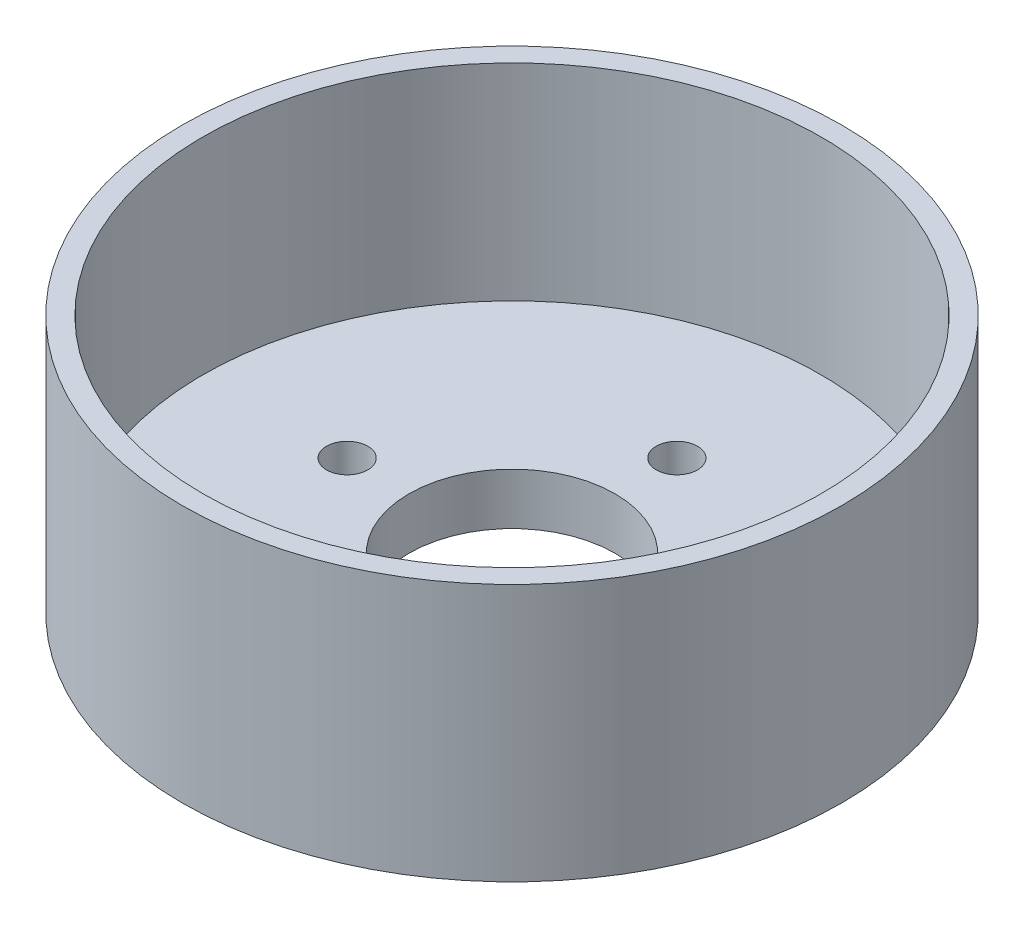
ISO-10303-21;
HEADER;
FILE_DESCRIPTION(('STEP AP214'),'2;1');
FILE_NAME('part.step','',(''),(''),'','','');
FILE_SCHEMA(('AUTOMOTIVE_DESIGN { 1 0 10303 214 1 1 1 1 }'));
ENDSEC;
DATA;
#1=APPLICATION_CONTEXT('core data for automotive mechanical design processes');
#2=APPLICATION_PROTOCOL_DEFINITION('international standard','automotive_design',2000,#1);
#3=PRODUCT_CONTEXT('',#1,'mechanical');
#4=PRODUCT('Part','Part','',(#3));
#5=PRODUCT_RELATED_PRODUCT_CATEGORY('part','',(#4));
#6=PRODUCT_DEFINITION_FORMATION('','',#4);
#7=PRODUCT_DEFINITION_CONTEXT('part definition',#1,'design');
#8=PRODUCT_DEFINITION('design','',#6,#7);
#9=PRODUCT_DEFINITION_SHAPE('','',#8);
#10=(LENGTH_UNIT() NAMED_UNIT(*) SI_UNIT(.MILLI.,.METRE.));
#11=(NAMED_UNIT(*) PLANE_ANGLE_UNIT() SI_UNIT($,.RADIAN.));
#12=(NAMED_UNIT(*) SI_UNIT($,.STERADIAN.) SOLID_ANGLE_UNIT());
#13=UNCERTAINTY_MEASURE_WITH_UNIT(LENGTH_MEASURE(1.E-05),#10,'distance_accuracy_value','');
#14=(GEOMETRIC_REPRESENTATION_CONTEXT(3) GLOBAL_UNCERTAINTY_ASSIGNED_CONTEXT((#13)) GLOBAL_UNIT_ASSIGNED_CONTEXT((#10,
#11,#12)) REPRESENTATION_CONTEXT('',''));
#15=CARTESIAN_POINT('',(0.,0.,0.));
#16=DIRECTION('',(0.,0.,1.));
#17=DIRECTION('',(1.,0.,0.));
#18=AXIS2_PLACEMENT_3D('',#15,#16,#17);
#19=CARTESIAN_POINT('',(0.,12.5,0.));
#20=DIRECTION('',(0.,-1.,0.));
#21=DIRECTION('',(0.,0.,-1.));
#22=AXIS2_PLACEMENT_3D('',#19,#20,#21);
#23=CYLINDRICAL_SURFACE('',#22,16.);
#24=CARTESIAN_POINT('',(0.,12.5,0.));
#25=DIRECTION('',(0.,1.,0.));
#26=DIRECTION('',(0.,0.,1.));
#27=AXIS2_PLACEMENT_3D('',#24,#25,#26);
#28=CIRCLE('',#27,16.);
#29=CARTESIAN_POINT('',(0.,12.5,16.));
#30=VERTEX_POINT('',#29);
#31=EDGE_CURVE('E10',#30,#30,#28,.T.);
#32=ORIENTED_EDGE('',*,*,#31,.F.);
#33=EDGE_LOOP('',(#32));
#34=FACE_BOUND('',#33,.T.);
#35=CARTESIAN_POINT('',(0.,0.,0.));
#36=DIRECTION('',(0.,1.,0.));
#37=DIRECTION('',(0.,0.,1.));
#38=AXIS2_PLACEMENT_3D('',#35,#36,#37);
#39=CIRCLE('',#38,16.);
#40=CARTESIAN_POINT('',(0.,0.,16.));
#41=VERTEX_POINT('',#40);
#42=EDGE_CURVE('E38',#41,#41,#39,.T.);
#43=ORIENTED_EDGE('',*,*,#42,.T.);
#44=EDGE_LOOP('',(#43));
#45=FACE_BOUND('',#44,.T.);
#46=ADVANCED_FACE('F31',(#34,#45),#23,.T.);
#47=CARTESIAN_POINT('',(0.,12.5,0.));
#48=DIRECTION('',(0.,1.,0.));
#49=DIRECTION('',(0.,0.,1.));
#50=AXIS2_PLACEMENT_3D('',#47,#48,#49);
#51=PLANE('',#50);
#52=CARTESIAN_POINT('',(0.,12.5,0.));
#53=DIRECTION('',(0.,1.,0.));
#54=DIRECTION('',(0.,0.,1.));
#55=AXIS2_PLACEMENT_3D('',#52,#53,#54);
#56=CIRCLE('',#55,15.);
#57=CARTESIAN_POINT('',(0.,12.5,15.));
#58=VERTEX_POINT('',#57);
#59=EDGE_CURVE('E46',#58,#58,#56,.T.);
#60=ORIENTED_EDGE('',*,*,#59,.F.);
#61=EDGE_LOOP('',(#60));
#62=FACE_BOUND('',#61,.T.);
#63=ORIENTED_EDGE('',*,*,#31,.T.);
#64=EDGE_LOOP('',(#63));
#65=FACE_BOUND('',#64,.T.);
#66=ADVANCED_FACE('F81',(#62,#65),#51,.T.);
#67=CARTESIAN_POINT('',(0.,0.,0.));
#68=DIRECTION('',(0.,1.,0.));
#69=DIRECTION('',(0.,0.,1.));
#70=AXIS2_PLACEMENT_3D('',#67,#68,#69);
#71=PLANE('',#70);
#72=CARTESIAN_POINT('',(0.,0.,-8.));
#73=DIRECTION('',(0.,-1.,0.));
#74=DIRECTION('',(0.,0.,-1.));
#75=AXIS2_PLACEMENT_3D('',#72,#73,#74);
#76=CIRCLE('',#75,1.);
#77=CARTESIAN_POINT('',(0.,0.,-9.));
#78=VERTEX_POINT('',#77);
#79=EDGE_CURVE('E57',#78,#78,#76,.T.);
#80=ORIENTED_EDGE('',*,*,#79,.F.);
#81=EDGE_LOOP('',(#80));
#82=FACE_BOUND('',#81,.T.);
#83=CARTESIAN_POINT('',(-8.,0.,0.));
#84=DIRECTION('',(0.,-1.,0.));
#85=DIRECTION('',(0.,0.,-1.));
#86=AXIS2_PLACEMENT_3D('',#83,#84,#85);
#87=CIRCLE('',#86,1.);
#88=CARTESIAN_POINT('',(-8.,0.,-1.));
#89=VERTEX_POINT('',#88);
#90=EDGE_CURVE('E121',#89,#89,#87,.T.);
#91=ORIENTED_EDGE('',*,*,#90,.F.);
#92=EDGE_LOOP('',(#91));
#93=FACE_BOUND('',#92,.T.);
#94=CARTESIAN_POINT('',(0.,0.,8.));
#95=DIRECTION('',(0.,-1.,0.));
#96=DIRECTION('',(0.,0.,-1.));
#97=AXIS2_PLACEMENT_3D('',#94,#95,#96);
#98=CIRCLE('',#97,1.);
#99=CARTESIAN_POINT('',(0.,0.,7.));
#100=VERTEX_POINT('',#99);
#101=EDGE_CURVE('E124',#100,#100,#98,.T.);
#102=ORIENTED_EDGE('',*,*,#101,.F.);
#103=EDGE_LOOP('',(#102));
#104=FACE_BOUND('',#103,.T.);
#105=CARTESIAN_POINT('',(8.,0.,0.));
#106=DIRECTION('',(0.,-1.,0.));
#107=DIRECTION('',(0.,0.,-1.));
#108=AXIS2_PLACEMENT_3D('',#105,#106,#107);
#109=CIRCLE('',#108,1.);
#110=CARTESIAN_POINT('',(8.,0.,-1.));
#111=VERTEX_POINT('',#110);
#112=EDGE_CURVE('E71',#111,#111,#109,.T.);
#113=ORIENTED_EDGE('',*,*,#112,.F.);
#114=EDGE_LOOP('',(#113));
#115=FACE_BOUND('',#114,.T.);
#116=CARTESIAN_POINT('',(0.,0.,0.));
#117=DIRECTION('',(0.,-1.,0.));
#118=DIRECTION('',(0.,0.,-1.));
#119=AXIS2_PLACEMENT_3D('',#116,#117,#118);
#120=CIRCLE('',#119,5.);
#121=CARTESIAN_POINT('',(0.,0.,-5.));
#122=VERTEX_POINT('',#121);
#123=EDGE_CURVE('E52',#122,#122,#120,.T.);
#124=ORIENTED_EDGE('',*,*,#123,.F.);
#125=EDGE_LOOP('',(#124));
#126=FACE_BOUND('',#125,.T.);
#127=ORIENTED_EDGE('',*,*,#42,.F.);
#128=EDGE_LOOP('',(#127));
#129=FACE_BOUND('',#128,.T.);
#130=ADVANCED_FACE('F83',(#82,#93,#104,#115,#126,#129),#71,.F.);
#131=CARTESIAN_POINT('',(0.,2.5,0.));
#132=DIRECTION('',(0.,1.,0.));
#133=DIRECTION('',(0.,0.,1.));
#134=AXIS2_PLACEMENT_3D('',#131,#132,#133);
#135=CYLINDRICAL_SURFACE('',#134,15.);
#136=CARTESIAN_POINT('',(0.,2.5,0.));
#137=DIRECTION('',(0.,1.,0.));
#138=DIRECTION('',(0.,0.,1.));
#139=AXIS2_PLACEMENT_3D('',#136,#137,#138);
#140=CIRCLE('',#139,15.);
#141=CARTESIAN_POINT('',(0.,2.5,15.));
#142=VERTEX_POINT('',#141);
#143=EDGE_CURVE('E43',#142,#142,#140,.T.);
#144=ORIENTED_EDGE('',*,*,#143,.F.);
#145=EDGE_LOOP('',(#144));
#146=FACE_BOUND('',#145,.T.);
#147=ORIENTED_EDGE('',*,*,#59,.T.);
#148=EDGE_LOOP('',(#147));
#149=FACE_BOUND('',#148,.T.);
#150=ADVANCED_FACE('F79',(#146,#149),#135,.F.);
#151=CARTESIAN_POINT('',(0.,2.5,0.));
#152=DIRECTION('',(0.,1.,0.));
#153=DIRECTION('',(0.,0.,1.));
#154=AXIS2_PLACEMENT_3D('',#151,#152,#153);
#155=PLANE('',#154);
#156=CARTESIAN_POINT('',(0.,2.5,-8.));
#157=DIRECTION('',(0.,1.,0.));
#158=DIRECTION('',(0.,0.,1.));
#159=AXIS2_PLACEMENT_3D('',#156,#157,#158);
#160=CIRCLE('',#159,1.);
#161=CARTESIAN_POINT('',(0.,2.5,-7.));
#162=VERTEX_POINT('',#161);
#163=EDGE_CURVE('E34',#162,#162,#160,.T.);
#164=ORIENTED_EDGE('',*,*,#163,.F.);
#165=EDGE_LOOP('',(#164));
#166=FACE_BOUND('',#165,.T.);
#167=CARTESIAN_POINT('',(-8.,2.5,0.));
#168=DIRECTION('',(0.,1.,0.));
#169=DIRECTION('',(0.,0.,1.));
#170=AXIS2_PLACEMENT_3D('',#167,#168,#169);
#171=CIRCLE('',#170,1.);
#172=CARTESIAN_POINT('',(-8.,2.5,1.));
#173=VERTEX_POINT('',#172);
#174=EDGE_CURVE('E59',#173,#173,#171,.T.);
#175=ORIENTED_EDGE('',*,*,#174,.F.);
#176=EDGE_LOOP('',(#175));
#177=FACE_BOUND('',#176,.T.);
#178=CARTESIAN_POINT('',(0.,2.5,8.));
#179=DIRECTION('',(0.,1.,0.));
#180=DIRECTION('',(0.,0.,1.));
#181=AXIS2_PLACEMENT_3D('',#178,#179,#180);
#182=CIRCLE('',#181,1.);
#183=CARTESIAN_POINT('',(0.,2.5,9.));
#184=VERTEX_POINT('',#183);
#185=EDGE_CURVE('E56',#184,#184,#182,.T.);
#186=ORIENTED_EDGE('',*,*,#185,.F.);
#187=EDGE_LOOP('',(#186));
#188=FACE_BOUND('',#187,.T.);
#189=CARTESIAN_POINT('',(8.,2.5,0.));
#190=DIRECTION('',(0.,1.,0.));
#191=DIRECTION('',(0.,0.,1.));
#192=AXIS2_PLACEMENT_3D('',#189,#190,#191);
#193=CIRCLE('',#192,1.);
#194=CARTESIAN_POINT('',(8.,2.5,1.));
#195=VERTEX_POINT('',#194);
#196=EDGE_CURVE('E53',#195,#195,#193,.T.);
#197=ORIENTED_EDGE('',*,*,#196,.F.);
#198=EDGE_LOOP('',(#197));
#199=FACE_BOUND('',#198,.T.);
#200=CARTESIAN_POINT('',(0.,2.5,0.));
#201=DIRECTION('',(0.,1.,0.));
#202=DIRECTION('',(0.,0.,1.));
#203=AXIS2_PLACEMENT_3D('',#200,#201,#202);
#204=CIRCLE('',#203,5.);
#205=CARTESIAN_POINT('',(0.,2.5,5.));
#206=VERTEX_POINT('',#205);
#207=EDGE_CURVE('E49',#206,#206,#204,.T.);
#208=ORIENTED_EDGE('',*,*,#207,.F.);
#209=EDGE_LOOP('',(#208));
#210=FACE_BOUND('',#209,.T.);
#211=ORIENTED_EDGE('',*,*,#143,.T.);
#212=EDGE_LOOP('',(#211));
#213=FACE_BOUND('',#212,.T.);
#214=ADVANCED_FACE('F94',(#166,#177,#188,#199,#210,#213),#155,.T.);
#215=CARTESIAN_POINT('',(0.,10.,0.));
#216=DIRECTION('',(0.,-1.,0.));
#217=DIRECTION('',(0.,0.,-1.));
#218=AXIS2_PLACEMENT_3D('',#215,#216,#217);
#219=CYLINDRICAL_SURFACE('',#218,5.);
#220=ORIENTED_EDGE('',*,*,#207,.T.);
#221=EDGE_LOOP('',(#220));
#222=FACE_BOUND('',#221,.T.);
#223=ORIENTED_EDGE('',*,*,#123,.T.);
#224=EDGE_LOOP('',(#223));
#225=FACE_BOUND('',#224,.T.);
#226=ADVANCED_FACE('F98',(#222,#225),#219,.F.);
#227=CARTESIAN_POINT('',(8.,10.,0.));
#228=DIRECTION('',(0.,-1.,0.));
#229=DIRECTION('',(0.,0.,-1.));
#230=AXIS2_PLACEMENT_3D('',#227,#228,#229);
#231=CYLINDRICAL_SURFACE('',#230,1.);
#232=ORIENTED_EDGE('',*,*,#196,.T.);
#233=EDGE_LOOP('',(#232));
#234=FACE_BOUND('',#233,.T.);
#235=ORIENTED_EDGE('',*,*,#112,.T.);
#236=EDGE_LOOP('',(#235));
#237=FACE_BOUND('',#236,.T.);
#238=ADVANCED_FACE('F102',(#234,#237),#231,.F.);
#239=CARTESIAN_POINT('',(0.,10.,8.));
#240=DIRECTION('',(0.,-1.,0.));
#241=DIRECTION('',(0.,0.,-1.));
#242=AXIS2_PLACEMENT_3D('',#239,#240,#241);
#243=CYLINDRICAL_SURFACE('',#242,1.);
#244=ORIENTED_EDGE('',*,*,#185,.T.);
#245=EDGE_LOOP('',(#244));
#246=FACE_BOUND('',#245,.T.);
#247=ORIENTED_EDGE('',*,*,#101,.T.);
#248=EDGE_LOOP('',(#247));
#249=FACE_BOUND('',#248,.T.);
#250=ADVANCED_FACE('F106',(#246,#249),#243,.F.);
#251=CARTESIAN_POINT('',(-8.,10.,0.));
#252=DIRECTION('',(0.,-1.,0.));
#253=DIRECTION('',(0.,0.,-1.));
#254=AXIS2_PLACEMENT_3D('',#251,#252,#253);
#255=CYLINDRICAL_SURFACE('',#254,1.);
#256=ORIENTED_EDGE('',*,*,#174,.T.);
#257=EDGE_LOOP('',(#256));
#258=FACE_BOUND('',#257,.T.);
#259=ORIENTED_EDGE('',*,*,#90,.T.);
#260=EDGE_LOOP('',(#259));
#261=FACE_BOUND('',#260,.T.);
#262=ADVANCED_FACE('F110',(#258,#261),#255,.F.);
#263=CARTESIAN_POINT('',(0.,10.,-8.));
#264=DIRECTION('',(0.,-1.,0.));
#265=DIRECTION('',(0.,0.,-1.));
#266=AXIS2_PLACEMENT_3D('',#263,#264,#265);
#267=CYLINDRICAL_SURFACE('',#266,1.);
#268=ORIENTED_EDGE('',*,*,#163,.T.);
#269=EDGE_LOOP('',(#268));
#270=FACE_BOUND('',#269,.T.);
#271=ORIENTED_EDGE('',*,*,#79,.T.);
#272=EDGE_LOOP('',(#271));
#273=FACE_BOUND('',#272,.T.);
#274=ADVANCED_FACE('F114',(#270,#273),#267,.F.);
#275=CLOSED_SHELL('',(#46,#66,#130,#150,#214,#226,#238,#250,#262,#274));
#276=MANIFOLD_SOLID_BREP('B2',#275);
#277=ADVANCED_BREP_SHAPE_REPRESENTATION('',(#18,#276),#14);
#278=SHAPE_DEFINITION_REPRESENTATION(#9,#277);
ENDSEC;
END-ISO-10303-21;
